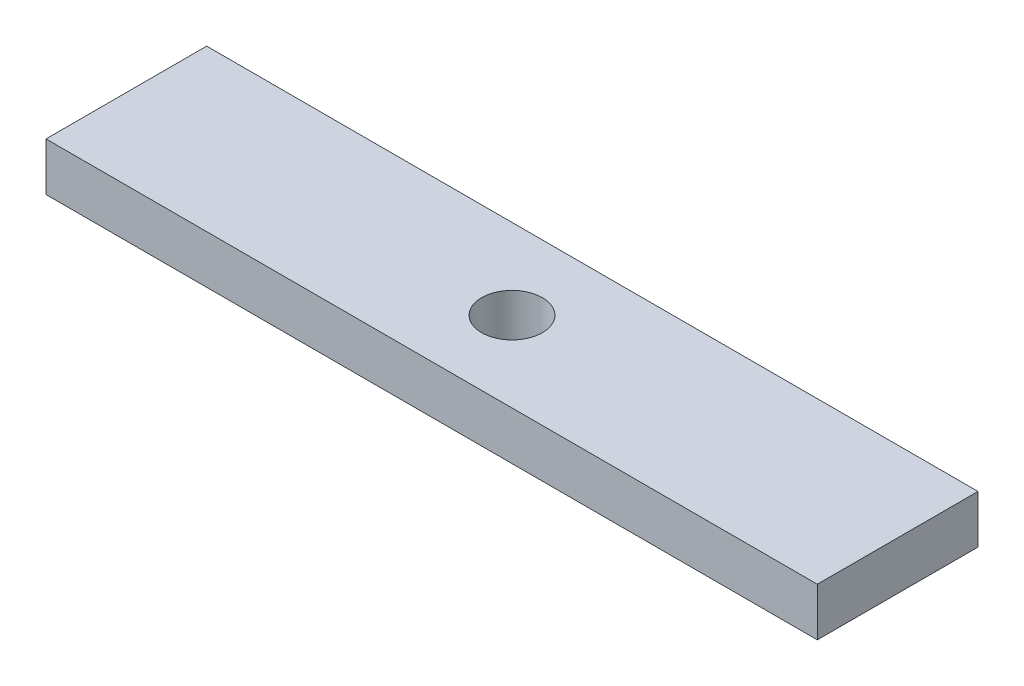
ISO-10303-21;
HEADER;
FILE_DESCRIPTION(('STEP AP214'),'2;1');
FILE_NAME('part.step','',(''),(''),'','','');
FILE_SCHEMA(('AUTOMOTIVE_DESIGN { 1 0 10303 214 1 1 1 1 }'));
ENDSEC;
DATA;
#1=APPLICATION_CONTEXT('core data for automotive mechanical design processes');
#2=APPLICATION_PROTOCOL_DEFINITION('international standard','automotive_design',2000,#1);
#3=PRODUCT_CONTEXT('',#1,'mechanical');
#4=PRODUCT('Part','Part','',(#3));
#5=PRODUCT_RELATED_PRODUCT_CATEGORY('part','',(#4));
#6=PRODUCT_DEFINITION_FORMATION('','',#4);
#7=PRODUCT_DEFINITION_CONTEXT('part definition',#1,'design');
#8=PRODUCT_DEFINITION('design','',#6,#7);
#9=PRODUCT_DEFINITION_SHAPE('','',#8);
#10=(LENGTH_UNIT() NAMED_UNIT(*) SI_UNIT(.MILLI.,.METRE.));
#11=(NAMED_UNIT(*) PLANE_ANGLE_UNIT() SI_UNIT($,.RADIAN.));
#12=(NAMED_UNIT(*) SI_UNIT($,.STERADIAN.) SOLID_ANGLE_UNIT());
#13=UNCERTAINTY_MEASURE_WITH_UNIT(LENGTH_MEASURE(1.E-05),#10,'distance_accuracy_value','');
#14=(GEOMETRIC_REPRESENTATION_CONTEXT(3) GLOBAL_UNCERTAINTY_ASSIGNED_CONTEXT((#13)) GLOBAL_UNIT_ASSIGNED_CONTEXT((#10,
#11,#12)) REPRESENTATION_CONTEXT('',''));
#15=CARTESIAN_POINT('',(0.,0.,0.));
#16=DIRECTION('',(0.,0.,1.));
#17=DIRECTION('',(1.,0.,0.));
#18=AXIS2_PLACEMENT_3D('',#15,#16,#17);
#19=CARTESIAN_POINT('',(76.2,4.7625,15.875));
#20=DIRECTION('',(-1.,0.,0.));
#21=DIRECTION('',(0.,0.,1.));
#22=AXIS2_PLACEMENT_3D('',#19,#20,#21);
#23=PLANE('',#22);
#24=DIRECTION('',(0.,0.,-1.));
#25=VECTOR('',#24,1.);
#26=CARTESIAN_POINT('',(76.2,-4.7625,15.875));
#27=LINE('',#26,#25);
#28=CARTESIAN_POINT('',(76.2,-4.7625,15.875));
#29=VERTEX_POINT('',#28);
#30=CARTESIAN_POINT('',(76.2,-4.7625,-15.875));
#31=VERTEX_POINT('',#30);
#32=EDGE_CURVE('E101',#29,#31,#27,.T.);
#33=ORIENTED_EDGE('',*,*,#32,.T.);
#34=DIRECTION('',(0.,-1.,0.));
#35=VECTOR('',#34,1.);
#36=CARTESIAN_POINT('',(76.2,4.7625,-15.875));
#37=LINE('',#36,#35);
#38=CARTESIAN_POINT('',(76.2,4.7625,-15.875));
#39=VERTEX_POINT('',#38);
#40=EDGE_CURVE('E11',#39,#31,#37,.T.);
#41=ORIENTED_EDGE('',*,*,#40,.F.);
#42=DIRECTION('',(0.,0.,-1.));
#43=VECTOR('',#42,1.);
#44=CARTESIAN_POINT('',(76.2,4.7625,15.875));
#45=LINE('',#44,#43);
#46=CARTESIAN_POINT('',(76.2,4.7625,15.875));
#47=VERTEX_POINT('',#46);
#48=EDGE_CURVE('E89',#47,#39,#45,.T.);
#49=ORIENTED_EDGE('',*,*,#48,.F.);
#50=DIRECTION('',(0.,-1.,0.));
#51=VECTOR('',#50,1.);
#52=CARTESIAN_POINT('',(76.2,4.7625,15.875));
#53=LINE('',#52,#51);
#54=EDGE_CURVE('E97',#47,#29,#53,.T.);
#55=ORIENTED_EDGE('',*,*,#54,.T.);
#56=EDGE_LOOP('',(#33,#41,#49,#55));
#57=FACE_BOUND('',#56,.T.);
#58=ADVANCED_FACE('F38',(#57),#23,.F.);
#59=CARTESIAN_POINT('',(-76.2,4.7625,-15.875));
#60=DIRECTION('',(0.,0.,1.));
#61=DIRECTION('',(1.,0.,0.));
#62=AXIS2_PLACEMENT_3D('',#59,#60,#61);
#63=PLANE('',#62);
#64=DIRECTION('',(-1.,0.,0.));
#65=VECTOR('',#64,1.);
#66=CARTESIAN_POINT('',(-76.2,-4.7625,-15.875));
#67=LINE('',#66,#65);
#68=CARTESIAN_POINT('',(-76.2,-4.7625,-15.875));
#69=VERTEX_POINT('',#68);
#70=EDGE_CURVE('E93',#31,#69,#67,.T.);
#71=ORIENTED_EDGE('',*,*,#70,.T.);
#72=DIRECTION('',(0.,-1.,0.));
#73=VECTOR('',#72,1.);
#74=CARTESIAN_POINT('',(-76.2,4.7625,-15.875));
#75=LINE('',#74,#73);
#76=CARTESIAN_POINT('',(-76.2,4.7625,-15.875));
#77=VERTEX_POINT('',#76);
#78=EDGE_CURVE('E46',#77,#69,#75,.T.);
#79=ORIENTED_EDGE('',*,*,#78,.F.);
#80=DIRECTION('',(-1.,0.,0.));
#81=VECTOR('',#80,1.);
#82=CARTESIAN_POINT('',(-76.2,4.7625,-15.875));
#83=LINE('',#82,#81);
#84=EDGE_CURVE('E84',#39,#77,#83,.T.);
#85=ORIENTED_EDGE('',*,*,#84,.F.);
#86=ORIENTED_EDGE('',*,*,#40,.T.);
#87=EDGE_LOOP('',(#71,#79,#85,#86));
#88=FACE_BOUND('',#87,.T.);
#89=ADVANCED_FACE('F92',(#88),#63,.F.);
#90=CARTESIAN_POINT('',(-76.2,4.7625,15.875));
#91=DIRECTION('',(1.,0.,0.));
#92=DIRECTION('',(0.,0.,-1.));
#93=AXIS2_PLACEMENT_3D('',#90,#91,#92);
#94=PLANE('',#93);
#95=DIRECTION('',(0.,0.,1.));
#96=VECTOR('',#95,1.);
#97=CARTESIAN_POINT('',(-76.2,-4.7625,15.875));
#98=LINE('',#97,#96);
#99=CARTESIAN_POINT('',(-76.2,-4.7625,15.875));
#100=VERTEX_POINT('',#99);
#101=EDGE_CURVE('E71',#69,#100,#98,.T.);
#102=ORIENTED_EDGE('',*,*,#101,.T.);
#103=DIRECTION('',(0.,-1.,0.));
#104=VECTOR('',#103,1.);
#105=CARTESIAN_POINT('',(-76.2,4.7625,15.875));
#106=LINE('',#105,#104);
#107=CARTESIAN_POINT('',(-76.2,4.7625,15.875));
#108=VERTEX_POINT('',#107);
#109=EDGE_CURVE('E94',#108,#100,#106,.T.);
#110=ORIENTED_EDGE('',*,*,#109,.F.);
#111=DIRECTION('',(0.,0.,1.));
#112=VECTOR('',#111,1.);
#113=CARTESIAN_POINT('',(-76.2,4.7625,15.875));
#114=LINE('',#113,#112);
#115=EDGE_CURVE('E87',#77,#108,#114,.T.);
#116=ORIENTED_EDGE('',*,*,#115,.F.);
#117=ORIENTED_EDGE('',*,*,#78,.T.);
#118=EDGE_LOOP('',(#102,#110,#116,#117));
#119=FACE_BOUND('',#118,.T.);
#120=ADVANCED_FACE('F95',(#119),#94,.F.);
#121=CARTESIAN_POINT('',(-76.2,4.7625,15.875));
#122=DIRECTION('',(0.,0.,-1.));
#123=DIRECTION('',(-1.,0.,0.));
#124=AXIS2_PLACEMENT_3D('',#121,#122,#123);
#125=PLANE('',#124);
#126=DIRECTION('',(1.,0.,0.));
#127=VECTOR('',#126,1.);
#128=CARTESIAN_POINT('',(-76.2,-4.7625,15.875));
#129=LINE('',#128,#127);
#130=EDGE_CURVE('E77',#100,#29,#129,.T.);
#131=ORIENTED_EDGE('',*,*,#130,.T.);
#132=ORIENTED_EDGE('',*,*,#54,.F.);
#133=DIRECTION('',(1.,0.,0.));
#134=VECTOR('',#133,1.);
#135=CARTESIAN_POINT('',(-76.2,4.7625,15.875));
#136=LINE('',#135,#134);
#137=EDGE_CURVE('E54',#108,#47,#136,.T.);
#138=ORIENTED_EDGE('',*,*,#137,.F.);
#139=ORIENTED_EDGE('',*,*,#109,.T.);
#140=EDGE_LOOP('',(#131,#132,#138,#139));
#141=FACE_BOUND('',#140,.T.);
#142=ADVANCED_FACE('F109',(#141),#125,.F.);
#143=CARTESIAN_POINT('',(0.,4.7625,0.));
#144=DIRECTION('',(0.,-1.,0.));
#145=DIRECTION('',(0.,0.,-1.));
#146=AXIS2_PLACEMENT_3D('',#143,#144,#145);
#147=PLANE('',#146);
#148=CARTESIAN_POINT('',(0.,4.7625,0.));
#149=DIRECTION('',(0.,-1.,0.));
#150=DIRECTION('',(0.,0.,-1.));
#151=AXIS2_PLACEMENT_3D('',#148,#149,#150);
#152=CIRCLE('',#151,6.);
#153=CARTESIAN_POINT('',(0.,4.7625,-6.));
#154=VERTEX_POINT('',#153);
#155=EDGE_CURVE('E104',#154,#154,#152,.T.);
#156=ORIENTED_EDGE('',*,*,#155,.T.);
#157=EDGE_LOOP('',(#156));
#158=FACE_BOUND('',#157,.T.);
#159=ORIENTED_EDGE('',*,*,#48,.T.);
#160=ORIENTED_EDGE('',*,*,#84,.T.);
#161=ORIENTED_EDGE('',*,*,#115,.T.);
#162=ORIENTED_EDGE('',*,*,#137,.T.);
#163=EDGE_LOOP('',(#159,#160,#161,#162));
#164=FACE_BOUND('',#163,.T.);
#165=ADVANCED_FACE('F85',(#158,#164),#147,.F.);
#166=CARTESIAN_POINT('',(0.,-4.7625,0.));
#167=DIRECTION('',(0.,-1.,0.));
#168=DIRECTION('',(0.,0.,-1.));
#169=AXIS2_PLACEMENT_3D('',#166,#167,#168);
#170=PLANE('',#169);
#171=CARTESIAN_POINT('',(0.,-4.7625,0.));
#172=DIRECTION('',(0.,-1.,0.));
#173=DIRECTION('',(0.,0.,-1.));
#174=AXIS2_PLACEMENT_3D('',#171,#172,#173);
#175=CIRCLE('',#174,5.99999999999999);
#176=CARTESIAN_POINT('',(0.,-4.7625,-5.99999999999999));
#177=VERTEX_POINT('',#176);
#178=EDGE_CURVE('E117',#177,#177,#175,.T.);
#179=ORIENTED_EDGE('',*,*,#178,.F.);
#180=EDGE_LOOP('',(#179));
#181=FACE_BOUND('',#180,.T.);
#182=ORIENTED_EDGE('',*,*,#32,.F.);
#183=ORIENTED_EDGE('',*,*,#130,.F.);
#184=ORIENTED_EDGE('',*,*,#101,.F.);
#185=ORIENTED_EDGE('',*,*,#70,.F.);
#186=EDGE_LOOP('',(#182,#183,#184,#185));
#187=FACE_BOUND('',#186,.T.);
#188=ADVANCED_FACE('F112',(#181,#187),#170,.T.);
#189=CARTESIAN_POINT('',(0.,-4.7625,0.));
#190=DIRECTION('',(0.,-1.,0.));
#191=DIRECTION('',(0.,0.,-1.));
#192=AXIS2_PLACEMENT_3D('',#189,#190,#191);
#193=CYLINDRICAL_SURFACE('',#192,5.99999999999999);
#194=ORIENTED_EDGE('',*,*,#155,.F.);
#195=EDGE_LOOP('',(#194));
#196=FACE_BOUND('',#195,.T.);
#197=ORIENTED_EDGE('',*,*,#178,.T.);
#198=EDGE_LOOP('',(#197));
#199=FACE_BOUND('',#198,.T.);
#200=ADVANCED_FACE('F121',(#196,#199),#193,.F.);
#201=CLOSED_SHELL('',(#58,#89,#120,#142,#165,#188,#200));
#202=MANIFOLD_SOLID_BREP('B2',#201);
#203=ADVANCED_BREP_SHAPE_REPRESENTATION('',(#18,#202),#14);
#204=SHAPE_DEFINITION_REPRESENTATION(#9,#203);
ENDSEC;
END-ISO-10303-21;
